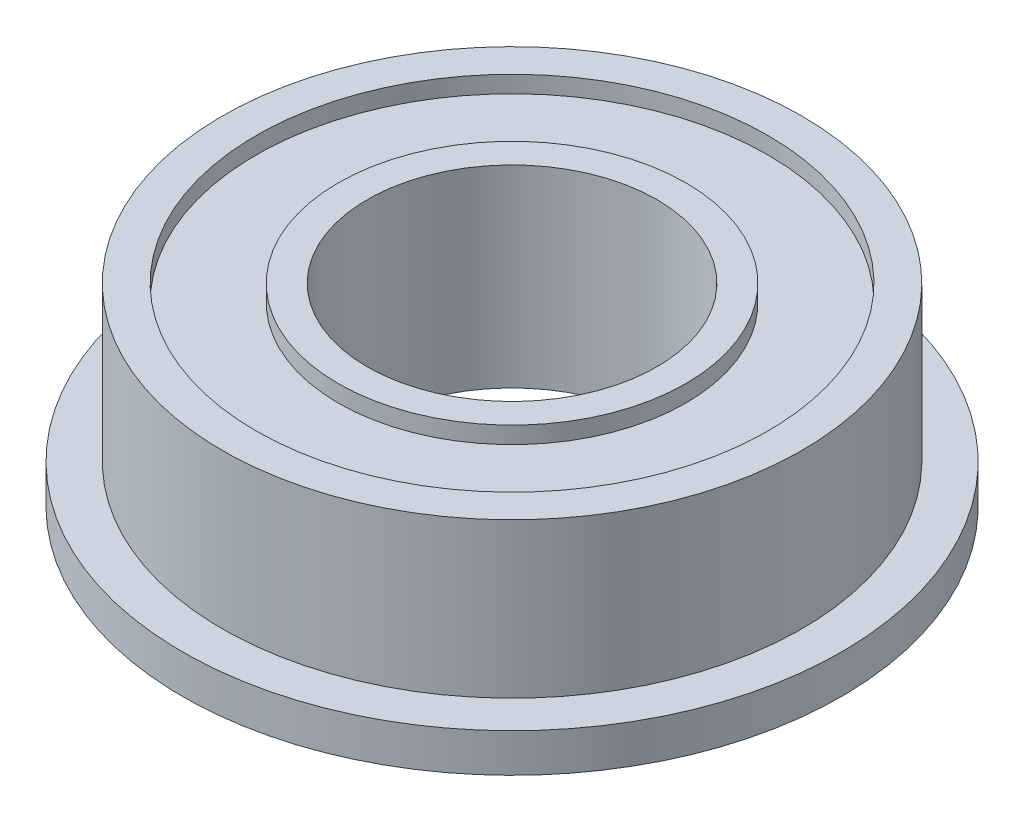
ISO-10303-21;
HEADER;
FILE_DESCRIPTION(('STEP AP214'),'2;1');
FILE_NAME('part.step','',(''),(''),'','','');
FILE_SCHEMA(('AUTOMOTIVE_DESIGN { 1 0 10303 214 1 1 1 1 }'));
ENDSEC;
DATA;
#1=APPLICATION_CONTEXT('core data for automotive mechanical design processes');
#2=APPLICATION_PROTOCOL_DEFINITION('international standard','automotive_design',2000,#1);
#3=PRODUCT_CONTEXT('',#1,'mechanical');
#4=PRODUCT('Part','Part','',(#3));
#5=PRODUCT_RELATED_PRODUCT_CATEGORY('part','',(#4));
#6=PRODUCT_DEFINITION_FORMATION('','',#4);
#7=PRODUCT_DEFINITION_CONTEXT('part definition',#1,'design');
#8=PRODUCT_DEFINITION('design','',#6,#7);
#9=PRODUCT_DEFINITION_SHAPE('','',#8);
#10=(LENGTH_UNIT() NAMED_UNIT(*) SI_UNIT(.MILLI.,.METRE.));
#11=(NAMED_UNIT(*) PLANE_ANGLE_UNIT() SI_UNIT($,.RADIAN.));
#12=(NAMED_UNIT(*) SI_UNIT($,.STERADIAN.) SOLID_ANGLE_UNIT());
#13=UNCERTAINTY_MEASURE_WITH_UNIT(LENGTH_MEASURE(1.E-05),#10,'distance_accuracy_value','');
#14=(GEOMETRIC_REPRESENTATION_CONTEXT(3) GLOBAL_UNCERTAINTY_ASSIGNED_CONTEXT((#13)) GLOBAL_UNIT_ASSIGNED_CONTEXT((#10,
#11,#12)) REPRESENTATION_CONTEXT('',''));
#15=CARTESIAN_POINT('',(0.,0.,0.));
#16=DIRECTION('',(0.,0.,1.));
#17=DIRECTION('',(1.,0.,0.));
#18=AXIS2_PLACEMENT_3D('',#15,#16,#17);
#19=CARTESIAN_POINT('',(0.,0.,0.));
#20=DIRECTION('',(0.,-1.,0.));
#21=DIRECTION('',(0.,0.,-1.));
#22=AXIS2_PLACEMENT_3D('',#19,#20,#21);
#23=CYLINDRICAL_SURFACE('',#22,5.3);
#24=CARTESIAN_POINT('',(0.,4.,0.));
#25=DIRECTION('',(0.,-1.,0.));
#26=DIRECTION('',(0.,0.,-1.));
#27=AXIS2_PLACEMENT_3D('',#24,#25,#26);
#28=CIRCLE('',#27,5.3);
#29=CARTESIAN_POINT('',(0.,4.,-5.3));
#30=VERTEX_POINT('',#29);
#31=EDGE_CURVE('E10',#30,#30,#28,.T.);
#32=ORIENTED_EDGE('',*,*,#31,.F.);
#33=EDGE_LOOP('',(#32));
#34=FACE_BOUND('',#33,.T.);
#35=CARTESIAN_POINT('',(0.,3.65,0.));
#36=DIRECTION('',(0.,-1.,0.));
#37=DIRECTION('',(0.,0.,-1.));
#38=AXIS2_PLACEMENT_3D('',#35,#36,#37);
#39=CIRCLE('',#38,5.3);
#40=CARTESIAN_POINT('',(0.,3.65,-5.3));
#41=VERTEX_POINT('',#40);
#42=EDGE_CURVE('E61',#41,#41,#39,.T.);
#43=ORIENTED_EDGE('',*,*,#42,.T.);
#44=EDGE_LOOP('',(#43));
#45=FACE_BOUND('',#44,.T.);
#46=ADVANCED_FACE('F15',(#34,#45),#23,.F.);
#47=CARTESIAN_POINT('',(-6.,4.,0.));
#48=DIRECTION('',(0.,-1.,0.));
#49=DIRECTION('',(0.,0.,-1.));
#50=AXIS2_PLACEMENT_3D('',#47,#48,#49);
#51=PLANE('',#50);
#52=CARTESIAN_POINT('',(0.,4.,0.));
#53=DIRECTION('',(0.,-1.,0.));
#54=DIRECTION('',(0.,0.,-1.));
#55=AXIS2_PLACEMENT_3D('',#52,#53,#54);
#56=CIRCLE('',#55,6.);
#57=CARTESIAN_POINT('',(0.,4.,-6.));
#58=VERTEX_POINT('',#57);
#59=EDGE_CURVE('E21',#58,#58,#56,.T.);
#60=ORIENTED_EDGE('',*,*,#59,.F.);
#61=EDGE_LOOP('',(#60));
#62=FACE_BOUND('',#61,.T.);
#63=ORIENTED_EDGE('',*,*,#31,.T.);
#64=EDGE_LOOP('',(#63));
#65=FACE_BOUND('',#64,.T.);
#66=ADVANCED_FACE('F134',(#62,#65),#51,.F.);
#67=CARTESIAN_POINT('',(0.,0.,0.));
#68=DIRECTION('',(0.,-1.,0.));
#69=DIRECTION('',(0.,0.,-1.));
#70=AXIS2_PLACEMENT_3D('',#67,#68,#69);
#71=CYLINDRICAL_SURFACE('',#70,6.);
#72=CARTESIAN_POINT('',(0.,0.8,0.));
#73=DIRECTION('',(0.,-1.,0.));
#74=DIRECTION('',(0.,0.,-1.));
#75=AXIS2_PLACEMENT_3D('',#72,#73,#74);
#76=CIRCLE('',#75,6.);
#77=CARTESIAN_POINT('',(0.,0.8,-6.));
#78=VERTEX_POINT('',#77);
#79=EDGE_CURVE('E25',#78,#78,#76,.T.);
#80=ORIENTED_EDGE('',*,*,#79,.F.);
#81=EDGE_LOOP('',(#80));
#82=FACE_BOUND('',#81,.T.);
#83=ORIENTED_EDGE('',*,*,#59,.T.);
#84=EDGE_LOOP('',(#83));
#85=FACE_BOUND('',#84,.T.);
#86=ADVANCED_FACE('F129',(#82,#85),#71,.T.);
#87=CARTESIAN_POINT('',(-6.825,0.8,0.));
#88=DIRECTION('',(0.,-1.,0.));
#89=DIRECTION('',(0.,0.,-1.));
#90=AXIS2_PLACEMENT_3D('',#87,#88,#89);
#91=PLANE('',#90);
#92=CARTESIAN_POINT('',(0.,0.8,0.));
#93=DIRECTION('',(0.,-1.,0.));
#94=DIRECTION('',(0.,0.,-1.));
#95=AXIS2_PLACEMENT_3D('',#92,#93,#94);
#96=CIRCLE('',#95,6.825);
#97=CARTESIAN_POINT('',(0.,0.8,-6.825));
#98=VERTEX_POINT('',#97);
#99=EDGE_CURVE('E29',#98,#98,#96,.T.);
#100=ORIENTED_EDGE('',*,*,#99,.F.);
#101=EDGE_LOOP('',(#100));
#102=FACE_BOUND('',#101,.T.);
#103=ORIENTED_EDGE('',*,*,#79,.T.);
#104=EDGE_LOOP('',(#103));
#105=FACE_BOUND('',#104,.T.);
#106=ADVANCED_FACE('F123',(#102,#105),#91,.F.);
#107=CARTESIAN_POINT('',(0.,0.,0.));
#108=DIRECTION('',(0.,-1.,0.));
#109=DIRECTION('',(0.,0.,-1.));
#110=AXIS2_PLACEMENT_3D('',#107,#108,#109);
#111=CYLINDRICAL_SURFACE('',#110,6.825);
#112=CARTESIAN_POINT('',(0.,0.,0.));
#113=DIRECTION('',(0.,-1.,0.));
#114=DIRECTION('',(0.,0.,-1.));
#115=AXIS2_PLACEMENT_3D('',#112,#113,#114);
#116=CIRCLE('',#115,6.825);
#117=CARTESIAN_POINT('',(0.,0.,-6.825));
#118=VERTEX_POINT('',#117);
#119=EDGE_CURVE('E34',#118,#118,#116,.T.);
#120=ORIENTED_EDGE('',*,*,#119,.F.);
#121=EDGE_LOOP('',(#120));
#122=FACE_BOUND('',#121,.T.);
#123=ORIENTED_EDGE('',*,*,#99,.T.);
#124=EDGE_LOOP('',(#123));
#125=FACE_BOUND('',#124,.T.);
#126=ADVANCED_FACE('F117',(#122,#125),#111,.T.);
#127=CARTESIAN_POINT('',(-5.3,0.,0.));
#128=DIRECTION('',(0.,1.,0.));
#129=DIRECTION('',(0.,0.,1.));
#130=AXIS2_PLACEMENT_3D('',#127,#128,#129);
#131=PLANE('',#130);
#132=CARTESIAN_POINT('',(0.,0.,0.));
#133=DIRECTION('',(0.,-1.,0.));
#134=DIRECTION('',(0.,0.,-1.));
#135=AXIS2_PLACEMENT_3D('',#132,#133,#134);
#136=CIRCLE('',#135,5.3);
#137=CARTESIAN_POINT('',(0.,0.,-5.3));
#138=VERTEX_POINT('',#137);
#139=EDGE_CURVE('E37',#138,#138,#136,.T.);
#140=ORIENTED_EDGE('',*,*,#139,.F.);
#141=EDGE_LOOP('',(#140));
#142=FACE_BOUND('',#141,.T.);
#143=ORIENTED_EDGE('',*,*,#119,.T.);
#144=EDGE_LOOP('',(#143));
#145=FACE_BOUND('',#144,.T.);
#146=ADVANCED_FACE('F111',(#142,#145),#131,.F.);
#147=CARTESIAN_POINT('',(0.,0.,0.));
#148=DIRECTION('',(0.,-1.,0.));
#149=DIRECTION('',(0.,0.,-1.));
#150=AXIS2_PLACEMENT_3D('',#147,#148,#149);
#151=CYLINDRICAL_SURFACE('',#150,5.3);
#152=CARTESIAN_POINT('',(0.,0.35,0.));
#153=DIRECTION('',(0.,-1.,0.));
#154=DIRECTION('',(0.,0.,-1.));
#155=AXIS2_PLACEMENT_3D('',#152,#153,#154);
#156=CIRCLE('',#155,5.3);
#157=CARTESIAN_POINT('',(0.,0.35,-5.3));
#158=VERTEX_POINT('',#157);
#159=EDGE_CURVE('E40',#158,#158,#156,.T.);
#160=ORIENTED_EDGE('',*,*,#159,.F.);
#161=EDGE_LOOP('',(#160));
#162=FACE_BOUND('',#161,.T.);
#163=ORIENTED_EDGE('',*,*,#139,.T.);
#164=EDGE_LOOP('',(#163));
#165=FACE_BOUND('',#164,.T.);
#166=ADVANCED_FACE('F105',(#162,#165),#151,.F.);
#167=CARTESIAN_POINT('',(-5.3,0.35,0.));
#168=DIRECTION('',(0.,1.,0.));
#169=DIRECTION('',(0.,0.,1.));
#170=AXIS2_PLACEMENT_3D('',#167,#168,#169);
#171=PLANE('',#170);
#172=CARTESIAN_POINT('',(0.,0.35,0.));
#173=DIRECTION('',(0.,-1.,0.));
#174=DIRECTION('',(0.,0.,-1.));
#175=AXIS2_PLACEMENT_3D('',#172,#173,#174);
#176=CIRCLE('',#175,3.6);
#177=CARTESIAN_POINT('',(0.,0.35,-3.6));
#178=VERTEX_POINT('',#177);
#179=EDGE_CURVE('E43',#178,#178,#176,.T.);
#180=ORIENTED_EDGE('',*,*,#179,.F.);
#181=EDGE_LOOP('',(#180));
#182=FACE_BOUND('',#181,.T.);
#183=ORIENTED_EDGE('',*,*,#159,.T.);
#184=EDGE_LOOP('',(#183));
#185=FACE_BOUND('',#184,.T.);
#186=ADVANCED_FACE('F99',(#182,#185),#171,.F.);
#187=CARTESIAN_POINT('',(0.,0.,0.));
#188=DIRECTION('',(0.,-1.,0.));
#189=DIRECTION('',(0.,0.,-1.));
#190=AXIS2_PLACEMENT_3D('',#187,#188,#189);
#191=CYLINDRICAL_SURFACE('',#190,3.6);
#192=CARTESIAN_POINT('',(0.,0.,0.));
#193=DIRECTION('',(0.,-1.,0.));
#194=DIRECTION('',(0.,0.,-1.));
#195=AXIS2_PLACEMENT_3D('',#192,#193,#194);
#196=CIRCLE('',#195,3.6);
#197=CARTESIAN_POINT('',(0.,0.,-3.6));
#198=VERTEX_POINT('',#197);
#199=EDGE_CURVE('E46',#198,#198,#196,.T.);
#200=ORIENTED_EDGE('',*,*,#199,.F.);
#201=EDGE_LOOP('',(#200));
#202=FACE_BOUND('',#201,.T.);
#203=ORIENTED_EDGE('',*,*,#179,.T.);
#204=EDGE_LOOP('',(#203));
#205=FACE_BOUND('',#204,.T.);
#206=ADVANCED_FACE('F93',(#202,#205),#191,.T.);
#207=CARTESIAN_POINT('',(-3.,0.,0.));
#208=DIRECTION('',(0.,1.,0.));
#209=DIRECTION('',(0.,0.,1.));
#210=AXIS2_PLACEMENT_3D('',#207,#208,#209);
#211=PLANE('',#210);
#212=CARTESIAN_POINT('',(0.,0.,0.));
#213=DIRECTION('',(0.,-1.,0.));
#214=DIRECTION('',(0.,0.,-1.));
#215=AXIS2_PLACEMENT_3D('',#212,#213,#214);
#216=CIRCLE('',#215,3.);
#217=CARTESIAN_POINT('',(0.,0.,-3.));
#218=VERTEX_POINT('',#217);
#219=EDGE_CURVE('E49',#218,#218,#216,.T.);
#220=ORIENTED_EDGE('',*,*,#219,.F.);
#221=EDGE_LOOP('',(#220));
#222=FACE_BOUND('',#221,.T.);
#223=ORIENTED_EDGE('',*,*,#199,.T.);
#224=EDGE_LOOP('',(#223));
#225=FACE_BOUND('',#224,.T.);
#226=ADVANCED_FACE('F87',(#222,#225),#211,.F.);
#227=CARTESIAN_POINT('',(0.,0.,0.));
#228=DIRECTION('',(0.,-1.,0.));
#229=DIRECTION('',(0.,0.,-1.));
#230=AXIS2_PLACEMENT_3D('',#227,#228,#229);
#231=CYLINDRICAL_SURFACE('',#230,3.);
#232=CARTESIAN_POINT('',(0.,4.,0.));
#233=DIRECTION('',(0.,-1.,0.));
#234=DIRECTION('',(0.,0.,-1.));
#235=AXIS2_PLACEMENT_3D('',#232,#233,#234);
#236=CIRCLE('',#235,3.);
#237=CARTESIAN_POINT('',(0.,4.,-3.));
#238=VERTEX_POINT('',#237);
#239=EDGE_CURVE('E52',#238,#238,#236,.T.);
#240=ORIENTED_EDGE('',*,*,#239,.F.);
#241=EDGE_LOOP('',(#240));
#242=FACE_BOUND('',#241,.T.);
#243=ORIENTED_EDGE('',*,*,#219,.T.);
#244=EDGE_LOOP('',(#243));
#245=FACE_BOUND('',#244,.T.);
#246=ADVANCED_FACE('F81',(#242,#245),#231,.F.);
#247=CARTESIAN_POINT('',(-3.6,4.,0.));
#248=DIRECTION('',(0.,-1.,0.));
#249=DIRECTION('',(0.,0.,-1.));
#250=AXIS2_PLACEMENT_3D('',#247,#248,#249);
#251=PLANE('',#250);
#252=CARTESIAN_POINT('',(0.,4.,0.));
#253=DIRECTION('',(0.,-1.,0.));
#254=DIRECTION('',(0.,0.,-1.));
#255=AXIS2_PLACEMENT_3D('',#252,#253,#254);
#256=CIRCLE('',#255,3.6);
#257=CARTESIAN_POINT('',(0.,4.,-3.6));
#258=VERTEX_POINT('',#257);
#259=EDGE_CURVE('E55',#258,#258,#256,.T.);
#260=ORIENTED_EDGE('',*,*,#259,.F.);
#261=EDGE_LOOP('',(#260));
#262=FACE_BOUND('',#261,.T.);
#263=ORIENTED_EDGE('',*,*,#239,.T.);
#264=EDGE_LOOP('',(#263));
#265=FACE_BOUND('',#264,.T.);
#266=ADVANCED_FACE('F75',(#262,#265),#251,.F.);
#267=CARTESIAN_POINT('',(0.,0.,0.));
#268=DIRECTION('',(0.,-1.,0.));
#269=DIRECTION('',(0.,0.,-1.));
#270=AXIS2_PLACEMENT_3D('',#267,#268,#269);
#271=CYLINDRICAL_SURFACE('',#270,3.6);
#272=CARTESIAN_POINT('',(0.,3.65,0.));
#273=DIRECTION('',(0.,-1.,0.));
#274=DIRECTION('',(0.,0.,-1.));
#275=AXIS2_PLACEMENT_3D('',#272,#273,#274);
#276=CIRCLE('',#275,3.6);
#277=CARTESIAN_POINT('',(0.,3.65,-3.6));
#278=VERTEX_POINT('',#277);
#279=EDGE_CURVE('E58',#278,#278,#276,.T.);
#280=ORIENTED_EDGE('',*,*,#279,.F.);
#281=EDGE_LOOP('',(#280));
#282=FACE_BOUND('',#281,.T.);
#283=ORIENTED_EDGE('',*,*,#259,.T.);
#284=EDGE_LOOP('',(#283));
#285=FACE_BOUND('',#284,.T.);
#286=ADVANCED_FACE('F69',(#282,#285),#271,.T.);
#287=CARTESIAN_POINT('',(-5.3,3.65,0.));
#288=DIRECTION('',(0.,-1.,0.));
#289=DIRECTION('',(0.,0.,-1.));
#290=AXIS2_PLACEMENT_3D('',#287,#288,#289);
#291=PLANE('',#290);
#292=ORIENTED_EDGE('',*,*,#42,.F.);
#293=EDGE_LOOP('',(#292));
#294=FACE_BOUND('',#293,.T.);
#295=ORIENTED_EDGE('',*,*,#279,.T.);
#296=EDGE_LOOP('',(#295));
#297=FACE_BOUND('',#296,.T.);
#298=ADVANCED_FACE('F66',(#294,#297),#291,.F.);
#299=CLOSED_SHELL('',(#46,#66,#86,#106,#126,#146,#166,#186,#206,#226,#246,#266,#286,#298));
#300=MANIFOLD_SOLID_BREP('B1',#299);
#301=ADVANCED_BREP_SHAPE_REPRESENTATION('',(#18,#300),#14);
#302=SHAPE_DEFINITION_REPRESENTATION(#9,#301);
ENDSEC;
END-ISO-10303-21;
